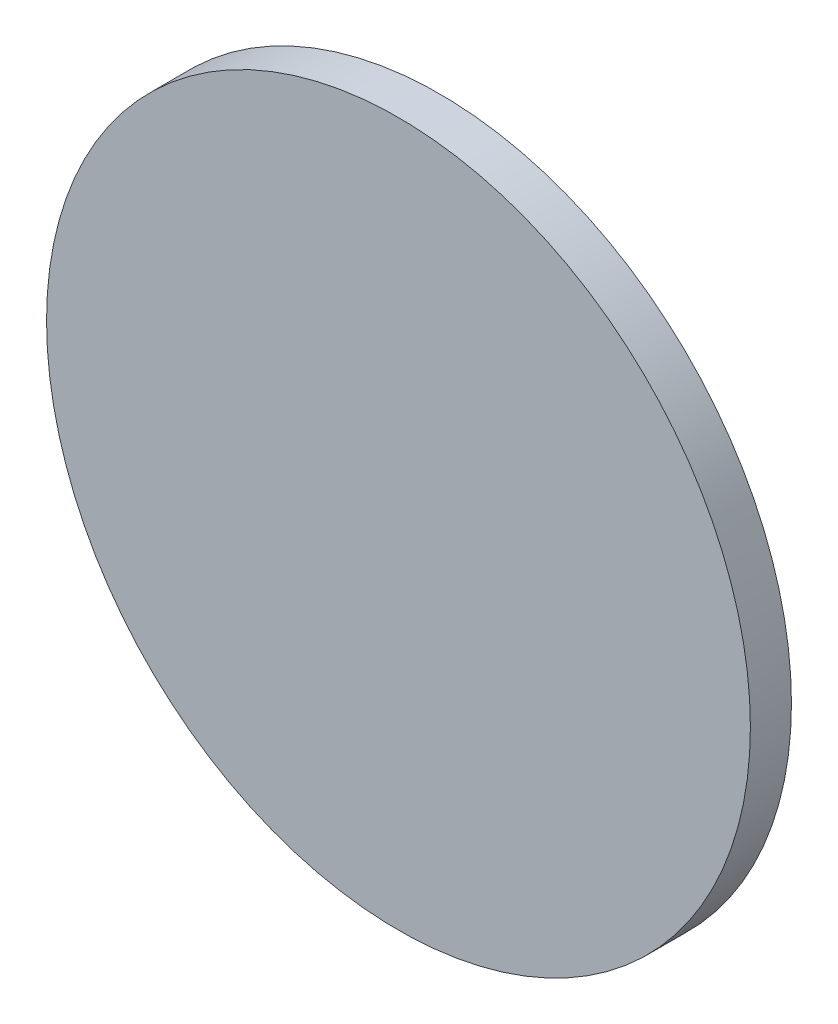
ISO-10303-21;
HEADER;
FILE_DESCRIPTION(('STEP AP214'),'2;1');
FILE_NAME('part.step','',(''),(''),'','','');
FILE_SCHEMA(('AUTOMOTIVE_DESIGN { 1 0 10303 214 1 1 1 1 }'));
ENDSEC;
DATA;
#1=APPLICATION_CONTEXT('core data for automotive mechanical design processes');
#2=APPLICATION_PROTOCOL_DEFINITION('international standard','automotive_design',2000,#1);
#3=PRODUCT_CONTEXT('',#1,'mechanical');
#4=PRODUCT('Part','Part','',(#3));
#5=PRODUCT_RELATED_PRODUCT_CATEGORY('part','',(#4));
#6=PRODUCT_DEFINITION_FORMATION('','',#4);
#7=PRODUCT_DEFINITION_CONTEXT('part definition',#1,'design');
#8=PRODUCT_DEFINITION('design','',#6,#7);
#9=PRODUCT_DEFINITION_SHAPE('','',#8);
#10=(LENGTH_UNIT() NAMED_UNIT(*) SI_UNIT(.MILLI.,.METRE.));
#11=(NAMED_UNIT(*) PLANE_ANGLE_UNIT() SI_UNIT($,.RADIAN.));
#12=(NAMED_UNIT(*) SI_UNIT($,.STERADIAN.) SOLID_ANGLE_UNIT());
#13=UNCERTAINTY_MEASURE_WITH_UNIT(LENGTH_MEASURE(1.E-05),#10,'distance_accuracy_value','');
#14=(GEOMETRIC_REPRESENTATION_CONTEXT(3) GLOBAL_UNCERTAINTY_ASSIGNED_CONTEXT((#13)) GLOBAL_UNIT_ASSIGNED_CONTEXT((#10,
#11,#12)) REPRESENTATION_CONTEXT('',''));
#15=CARTESIAN_POINT('',(0.,0.,0.));
#16=DIRECTION('',(0.,0.,1.));
#17=DIRECTION('',(1.,0.,0.));
#18=AXIS2_PLACEMENT_3D('',#15,#16,#17);
#19=CARTESIAN_POINT('',(0.,0.,0.7));
#20=DIRECTION('',(0.,0.,-1.));
#21=DIRECTION('',(-1.,0.,0.));
#22=AXIS2_PLACEMENT_3D('',#19,#20,#21);
#23=CYLINDRICAL_SURFACE('',#22,6.);
#24=CARTESIAN_POINT('',(0.,0.,0.7));
#25=DIRECTION('',(0.,0.,1.));
#26=DIRECTION('',(1.,0.,0.));
#27=AXIS2_PLACEMENT_3D('',#24,#25,#26);
#28=CIRCLE('',#27,6.);
#29=CARTESIAN_POINT('',(6.,0.,0.7));
#30=VERTEX_POINT('',#29);
#31=EDGE_CURVE('E10',#30,#30,#28,.T.);
#32=ORIENTED_EDGE('',*,*,#31,.F.);
#33=EDGE_LOOP('',(#32));
#34=FACE_BOUND('',#33,.T.);
#35=CARTESIAN_POINT('',(0.,0.,0.));
#36=DIRECTION('',(0.,0.,1.));
#37=DIRECTION('',(1.,0.,0.));
#38=AXIS2_PLACEMENT_3D('',#35,#36,#37);
#39=CIRCLE('',#38,6.);
#40=CARTESIAN_POINT('',(6.,0.,0.));
#41=VERTEX_POINT('',#40);
#42=EDGE_CURVE('E42',#41,#41,#39,.T.);
#43=ORIENTED_EDGE('',*,*,#42,.T.);
#44=EDGE_LOOP('',(#43));
#45=FACE_BOUND('',#44,.T.);
#46=ADVANCED_FACE('F39',(#34,#45),#23,.T.);
#47=CARTESIAN_POINT('',(0.,0.,0.7));
#48=DIRECTION('',(0.,0.,1.));
#49=DIRECTION('',(1.,0.,0.));
#50=AXIS2_PLACEMENT_3D('',#47,#48,#49);
#51=PLANE('',#50);
#52=ORIENTED_EDGE('',*,*,#31,.T.);
#53=EDGE_LOOP('',(#52));
#54=FACE_BOUND('',#53,.T.);
#55=ADVANCED_FACE('F54',(#54),#51,.T.);
#56=CARTESIAN_POINT('',(0.,0.,0.));
#57=DIRECTION('',(0.,0.,1.));
#58=DIRECTION('',(1.,0.,0.));
#59=AXIS2_PLACEMENT_3D('',#56,#57,#58);
#60=PLANE('',#59);
#61=ORIENTED_EDGE('',*,*,#42,.F.);
#62=EDGE_LOOP('',(#61));
#63=FACE_BOUND('',#62,.T.);
#64=ADVANCED_FACE('F52',(#63),#60,.F.);
#65=CLOSED_SHELL('',(#46,#55,#64));
#66=MANIFOLD_SOLID_BREP('B2',#65);
#67=ADVANCED_BREP_SHAPE_REPRESENTATION('',(#18,#66),#14);
#68=SHAPE_DEFINITION_REPRESENTATION(#9,#67);
ENDSEC;
END-ISO-10303-21;
